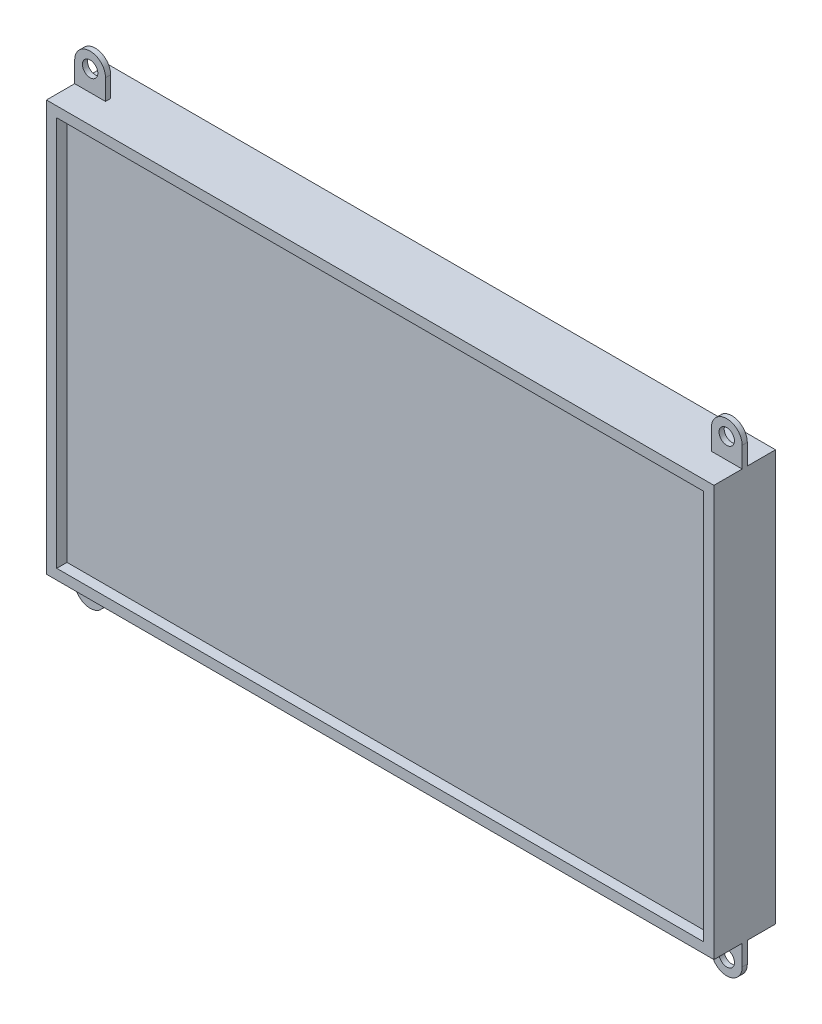
ISO-10303-21;
HEADER;
FILE_DESCRIPTION(('STEP AP214'),'2;1');
FILE_NAME('part.step','',(''),(''),'','','');
FILE_SCHEMA(('AUTOMOTIVE_DESIGN { 1 0 10303 214 1 1 1 1 }'));
ENDSEC;
DATA;
#1=APPLICATION_CONTEXT('core data for automotive mechanical design processes');
#2=APPLICATION_PROTOCOL_DEFINITION('international standard','automotive_design',2000,#1);
#3=PRODUCT_CONTEXT('',#1,'mechanical');
#4=PRODUCT('Part','Part','',(#3));
#5=PRODUCT_RELATED_PRODUCT_CATEGORY('part','',(#4));
#6=PRODUCT_DEFINITION_FORMATION('','',#4);
#7=PRODUCT_DEFINITION_CONTEXT('part definition',#1,'design');
#8=PRODUCT_DEFINITION('design','',#6,#7);
#9=PRODUCT_DEFINITION_SHAPE('','',#8);
#10=(LENGTH_UNIT() NAMED_UNIT(*) SI_UNIT(.MILLI.,.METRE.));
#11=(NAMED_UNIT(*) PLANE_ANGLE_UNIT() SI_UNIT($,.RADIAN.));
#12=(NAMED_UNIT(*) SI_UNIT($,.STERADIAN.) SOLID_ANGLE_UNIT());
#13=UNCERTAINTY_MEASURE_WITH_UNIT(LENGTH_MEASURE(1.E-05),#10,'distance_accuracy_value','');
#14=(GEOMETRIC_REPRESENTATION_CONTEXT(3) GLOBAL_UNCERTAINTY_ASSIGNED_CONTEXT((#13)) GLOBAL_UNIT_ASSIGNED_CONTEXT((#10,
#11,#12)) REPRESENTATION_CONTEXT('',''));
#15=CARTESIAN_POINT('',(0.,0.,0.));
#16=DIRECTION('',(0.,0.,1.));
#17=DIRECTION('',(1.,0.,0.));
#18=AXIS2_PLACEMENT_3D('',#15,#16,#17);
#19=CARTESIAN_POINT('',(-82.55,50.8,7.62));
#20=DIRECTION('',(0.,-1.,0.));
#21=DIRECTION('',(0.,0.,-1.));
#22=AXIS2_PLACEMENT_3D('',#19,#20,#21);
#23=PLANE('',#22);
#24=DIRECTION('',(0.,0.,-1.));
#25=VECTOR('',#24,1.);
#26=CARTESIAN_POINT('',(-74.93,50.8,0.635));
#27=LINE('',#26,#25);
#28=CARTESIAN_POINT('',(-74.93,50.8,0.635));
#29=VERTEX_POINT('',#28);
#30=CARTESIAN_POINT('',(-74.93,50.8,-0.635));
#31=VERTEX_POINT('',#30);
#32=EDGE_CURVE('E214',#29,#31,#27,.T.);
#33=ORIENTED_EDGE('',*,*,#32,.F.);
#34=DIRECTION('',(1.,0.,0.));
#35=VECTOR('',#34,1.);
#36=CARTESIAN_POINT('',(-82.55,50.8,0.635));
#37=LINE('',#36,#35);
#38=CARTESIAN_POINT('',(-82.55,50.8,0.635));
#39=VERTEX_POINT('',#38);
#40=EDGE_CURVE('E200',#39,#29,#37,.T.);
#41=ORIENTED_EDGE('',*,*,#40,.F.);
#42=DIRECTION('',(0.,0.,-1.));
#43=VECTOR('',#42,1.);
#44=CARTESIAN_POINT('',(-82.55,50.8,7.62));
#45=LINE('',#44,#43);
#46=CARTESIAN_POINT('',(-82.55,50.8,7.62));
#47=VERTEX_POINT('',#46);
#48=EDGE_CURVE('E211',#47,#39,#45,.T.);
#49=ORIENTED_EDGE('',*,*,#48,.F.);
#50=DIRECTION('',(-1.,0.,0.));
#51=VECTOR('',#50,1.);
#52=CARTESIAN_POINT('',(-82.55,50.8,7.62));
#53=LINE('',#52,#51);
#54=CARTESIAN_POINT('',(82.55,50.8,7.62));
#55=VERTEX_POINT('',#54);
#56=EDGE_CURVE('E302',#55,#47,#53,.T.);
#57=ORIENTED_EDGE('',*,*,#56,.F.);
#58=DIRECTION('',(0.,0.,-1.));
#59=VECTOR('',#58,1.);
#60=CARTESIAN_POINT('',(82.55,50.8,7.62));
#61=LINE('',#60,#59);
#62=CARTESIAN_POINT('',(82.55,50.8,0.635));
#63=VERTEX_POINT('',#62);
#64=EDGE_CURVE('E11',#55,#63,#61,.T.);
#65=ORIENTED_EDGE('',*,*,#64,.T.);
#66=DIRECTION('',(-1.,0.,0.));
#67=VECTOR('',#66,1.);
#68=CARTESIAN_POINT('',(82.55,50.8,0.635));
#69=LINE('',#68,#67);
#70=CARTESIAN_POINT('',(74.93,50.8,0.635));
#71=VERTEX_POINT('',#70);
#72=EDGE_CURVE('E231',#63,#71,#69,.T.);
#73=ORIENTED_EDGE('',*,*,#72,.T.);
#74=DIRECTION('',(0.,0.,-1.));
#75=VECTOR('',#74,1.);
#76=CARTESIAN_POINT('',(74.93,50.8,0.635));
#77=LINE('',#76,#75);
#78=CARTESIAN_POINT('',(74.93,50.8,-0.635));
#79=VERTEX_POINT('',#78);
#80=EDGE_CURVE('E241',#71,#79,#77,.T.);
#81=ORIENTED_EDGE('',*,*,#80,.T.);
#82=DIRECTION('',(-1.,0.,0.));
#83=VECTOR('',#82,1.);
#84=CARTESIAN_POINT('',(82.55,50.8,-0.635));
#85=LINE('',#84,#83);
#86=CARTESIAN_POINT('',(82.55,50.8,-0.635));
#87=VERTEX_POINT('',#86);
#88=EDGE_CURVE('E245',#87,#79,#85,.T.);
#89=ORIENTED_EDGE('',*,*,#88,.F.);
#90=CARTESIAN_POINT('',(82.55,50.8,-7.62));
#91=VERTEX_POINT('',#90);
#92=EDGE_CURVE('E42',#87,#91,#61,.T.);
#93=ORIENTED_EDGE('',*,*,#92,.T.);
#94=DIRECTION('',(-1.,0.,0.));
#95=VECTOR('',#94,1.);
#96=CARTESIAN_POINT('',(-82.55,50.8,-7.62));
#97=LINE('',#96,#95);
#98=CARTESIAN_POINT('',(-82.55,50.8,-7.62));
#99=VERTEX_POINT('',#98);
#100=EDGE_CURVE('E311',#91,#99,#97,.T.);
#101=ORIENTED_EDGE('',*,*,#100,.T.);
#102=CARTESIAN_POINT('',(-82.55,50.8,-0.634999999999998));
#103=VERTEX_POINT('',#102);
#104=EDGE_CURVE('E221',#103,#99,#45,.T.);
#105=ORIENTED_EDGE('',*,*,#104,.F.);
#106=DIRECTION('',(1.,0.,0.));
#107=VECTOR('',#106,1.);
#108=CARTESIAN_POINT('',(-82.55,50.8,-0.635));
#109=LINE('',#108,#107);
#110=EDGE_CURVE('E50',#103,#31,#109,.T.);
#111=ORIENTED_EDGE('',*,*,#110,.T.);
#112=EDGE_LOOP('',(#33,#41,#49,#57,#65,#73,#81,#89,#93,#101,#105,#111));
#113=FACE_BOUND('',#112,.T.);
#114=ADVANCED_FACE('F33',(#113),#23,.F.);
#115=CARTESIAN_POINT('',(82.55,50.8,7.62));
#116=DIRECTION('',(-1.,0.,0.));
#117=DIRECTION('',(0.,0.,1.));
#118=AXIS2_PLACEMENT_3D('',#115,#116,#117);
#119=PLANE('',#118);
#120=DIRECTION('',(0.,1.,0.));
#121=VECTOR('',#120,1.);
#122=CARTESIAN_POINT('',(82.55,50.8,-7.62));
#123=LINE('',#122,#121);
#124=CARTESIAN_POINT('',(82.55,-50.8,-7.62));
#125=VERTEX_POINT('',#124);
#126=EDGE_CURVE('E292',#125,#91,#123,.T.);
#127=ORIENTED_EDGE('',*,*,#126,.T.);
#128=ORIENTED_EDGE('',*,*,#92,.F.);
#129=DIRECTION('',(0.,-1.,0.));
#130=VECTOR('',#129,1.);
#131=CARTESIAN_POINT('',(82.55,55.88,-0.635));
#132=LINE('',#131,#130);
#133=CARTESIAN_POINT('',(82.55,55.88,-0.635));
#134=VERTEX_POINT('',#133);
#135=EDGE_CURVE('E235',#134,#87,#132,.T.);
#136=ORIENTED_EDGE('',*,*,#135,.F.);
#137=DIRECTION('',(0.,0.,-1.));
#138=VECTOR('',#137,1.);
#139=CARTESIAN_POINT('',(82.55,55.88,0.635));
#140=LINE('',#139,#138);
#141=CARTESIAN_POINT('',(82.55,55.88,0.635));
#142=VERTEX_POINT('',#141);
#143=EDGE_CURVE('E260',#142,#134,#140,.T.);
#144=ORIENTED_EDGE('',*,*,#143,.F.);
#145=DIRECTION('',(0.,-1.,0.));
#146=VECTOR('',#145,1.);
#147=CARTESIAN_POINT('',(82.55,55.88,0.635));
#148=LINE('',#147,#146);
#149=EDGE_CURVE('E238',#142,#63,#148,.T.);
#150=ORIENTED_EDGE('',*,*,#149,.T.);
#151=ORIENTED_EDGE('',*,*,#64,.F.);
#152=DIRECTION('',(0.,1.,0.));
#153=VECTOR('',#152,1.);
#154=CARTESIAN_POINT('',(82.55,50.8,7.62));
#155=LINE('',#154,#153);
#156=CARTESIAN_POINT('',(82.55,-50.8,7.62));
#157=VERTEX_POINT('',#156);
#158=EDGE_CURVE('E299',#157,#55,#155,.T.);
#159=ORIENTED_EDGE('',*,*,#158,.F.);
#160=DIRECTION('',(0.,0.,-1.));
#161=VECTOR('',#160,1.);
#162=CARTESIAN_POINT('',(82.55,-50.8,7.62));
#163=LINE('',#162,#161);
#164=CARTESIAN_POINT('',(82.55,-50.8,0.635000000000004));
#165=VERTEX_POINT('',#164);
#166=EDGE_CURVE('E322',#157,#165,#163,.T.);
#167=ORIENTED_EDGE('',*,*,#166,.T.);
#168=DIRECTION('',(0.,1.,0.));
#169=VECTOR('',#168,1.);
#170=CARTESIAN_POINT('',(82.55,-55.88,0.635));
#171=LINE('',#170,#169);
#172=CARTESIAN_POINT('',(82.55,-55.88,0.635));
#173=VERTEX_POINT('',#172);
#174=EDGE_CURVE('E364',#173,#165,#171,.T.);
#175=ORIENTED_EDGE('',*,*,#174,.F.);
#176=DIRECTION('',(0.,0.,-1.));
#177=VECTOR('',#176,1.);
#178=CARTESIAN_POINT('',(82.55,-55.88,0.635));
#179=LINE('',#178,#177);
#180=CARTESIAN_POINT('',(82.55,-55.88,-0.635));
#181=VERTEX_POINT('',#180);
#182=EDGE_CURVE('E340',#173,#181,#179,.T.);
#183=ORIENTED_EDGE('',*,*,#182,.T.);
#184=DIRECTION('',(0.,1.,0.));
#185=VECTOR('',#184,1.);
#186=CARTESIAN_POINT('',(82.55,-55.88,-0.635));
#187=LINE('',#186,#185);
#188=CARTESIAN_POINT('',(82.55,-50.8,-0.634999999999992));
#189=VERTEX_POINT('',#188);
#190=EDGE_CURVE('E381',#181,#189,#187,.T.);
#191=ORIENTED_EDGE('',*,*,#190,.T.);
#192=EDGE_CURVE('E308',#189,#125,#163,.T.);
#193=ORIENTED_EDGE('',*,*,#192,.T.);
#194=EDGE_LOOP('',(#127,#128,#136,#144,#150,#151,#159,#167,#175,#183,#191,#193));
#195=FACE_BOUND('',#194,.T.);
#196=ADVANCED_FACE('F35',(#195),#119,.F.);
#197=CARTESIAN_POINT('',(-82.55,50.8,7.62));
#198=DIRECTION('',(1.,0.,0.));
#199=DIRECTION('',(0.,1.,0.));
#200=AXIS2_PLACEMENT_3D('',#197,#198,#199);
#201=PLANE('',#200);
#202=DIRECTION('',(0.,-1.,0.));
#203=VECTOR('',#202,1.);
#204=CARTESIAN_POINT('',(-82.55,50.8,-7.62));
#205=LINE('',#204,#203);
#206=CARTESIAN_POINT('',(-82.55,-50.8,-7.62));
#207=VERTEX_POINT('',#206);
#208=EDGE_CURVE('E314',#99,#207,#205,.T.);
#209=ORIENTED_EDGE('',*,*,#208,.T.);
#210=DIRECTION('',(0.,0.,-1.));
#211=VECTOR('',#210,1.);
#212=CARTESIAN_POINT('',(-82.55,-50.8,7.62));
#213=LINE('',#212,#211);
#214=CARTESIAN_POINT('',(-82.55,-50.8,-0.634999999999996));
#215=VERTEX_POINT('',#214);
#216=EDGE_CURVE('E325',#215,#207,#213,.T.);
#217=ORIENTED_EDGE('',*,*,#216,.F.);
#218=DIRECTION('',(0.,1.,0.));
#219=VECTOR('',#218,1.);
#220=CARTESIAN_POINT('',(-82.55,-55.88,-0.635));
#221=LINE('',#220,#219);
#222=CARTESIAN_POINT('',(-82.55,-55.88,-0.635));
#223=VERTEX_POINT('',#222);
#224=EDGE_CURVE('E710',#223,#215,#221,.T.);
#225=ORIENTED_EDGE('',*,*,#224,.F.);
#226=DIRECTION('',(0.,0.,-1.));
#227=VECTOR('',#226,1.);
#228=CARTESIAN_POINT('',(-82.55,-55.88,0.635));
#229=LINE('',#228,#227);
#230=CARTESIAN_POINT('',(-82.55,-55.88,0.635));
#231=VERTEX_POINT('',#230);
#232=EDGE_CURVE('E731',#231,#223,#229,.T.);
#233=ORIENTED_EDGE('',*,*,#232,.F.);
#234=DIRECTION('',(0.,1.,0.));
#235=VECTOR('',#234,1.);
#236=CARTESIAN_POINT('',(-82.55,-55.88,0.635));
#237=LINE('',#236,#235);
#238=CARTESIAN_POINT('',(-82.55,-50.8,0.635000000000002));
#239=VERTEX_POINT('',#238);
#240=EDGE_CURVE('E716',#231,#239,#237,.T.);
#241=ORIENTED_EDGE('',*,*,#240,.T.);
#242=CARTESIAN_POINT('',(-82.55,-50.8,7.62));
#243=VERTEX_POINT('',#242);
#244=EDGE_CURVE('E224',#243,#239,#213,.T.);
#245=ORIENTED_EDGE('',*,*,#244,.F.);
#246=DIRECTION('',(0.,-1.,0.));
#247=VECTOR('',#246,1.);
#248=CARTESIAN_POINT('',(-82.55,50.8,7.62));
#249=LINE('',#248,#247);
#250=EDGE_CURVE('E220',#47,#243,#249,.T.);
#251=ORIENTED_EDGE('',*,*,#250,.F.);
#252=ORIENTED_EDGE('',*,*,#48,.T.);
#253=DIRECTION('',(0.,-1.,0.));
#254=VECTOR('',#253,1.);
#255=CARTESIAN_POINT('',(-82.55,55.88,0.635));
#256=LINE('',#255,#254);
#257=CARTESIAN_POINT('',(-82.55,55.88,0.635));
#258=VERTEX_POINT('',#257);
#259=EDGE_CURVE('E197',#258,#39,#256,.T.);
#260=ORIENTED_EDGE('',*,*,#259,.F.);
#261=DIRECTION('',(0.,0.,-1.));
#262=VECTOR('',#261,1.);
#263=CARTESIAN_POINT('',(-82.55,55.88,0.635));
#264=LINE('',#263,#262);
#265=CARTESIAN_POINT('',(-82.55,55.88,-0.635));
#266=VERTEX_POINT('',#265);
#267=EDGE_CURVE('E693',#258,#266,#264,.T.);
#268=ORIENTED_EDGE('',*,*,#267,.T.);
#269=DIRECTION('',(0.,-1.,0.));
#270=VECTOR('',#269,1.);
#271=CARTESIAN_POINT('',(-82.55,55.88,-0.635));
#272=LINE('',#271,#270);
#273=EDGE_CURVE('E687',#266,#103,#272,.T.);
#274=ORIENTED_EDGE('',*,*,#273,.T.);
#275=ORIENTED_EDGE('',*,*,#104,.T.);
#276=EDGE_LOOP('',(#209,#217,#225,#233,#241,#245,#251,#252,#260,#268,#274,#275));
#277=FACE_BOUND('',#276,.T.);
#278=ADVANCED_FACE('F218',(#277),#201,.F.);
#279=CARTESIAN_POINT('',(-82.55,-50.8,7.62));
#280=DIRECTION('',(0.,1.,0.));
#281=DIRECTION('',(0.,0.,1.));
#282=AXIS2_PLACEMENT_3D('',#279,#280,#281);
#283=PLANE('',#282);
#284=ORIENTED_EDGE('',*,*,#244,.T.);
#285=DIRECTION('',(1.,0.,0.));
#286=VECTOR('',#285,1.);
#287=CARTESIAN_POINT('',(-82.55,-50.8,0.635));
#288=LINE('',#287,#286);
#289=CARTESIAN_POINT('',(-74.93,-50.8,0.635));
#290=VERTEX_POINT('',#289);
#291=EDGE_CURVE('E58',#239,#290,#288,.T.);
#292=ORIENTED_EDGE('',*,*,#291,.T.);
#293=DIRECTION('',(0.,0.,-1.));
#294=VECTOR('',#293,1.);
#295=CARTESIAN_POINT('',(-74.93,-50.8,0.635));
#296=LINE('',#295,#294);
#297=CARTESIAN_POINT('',(-74.93,-50.8,-0.635));
#298=VERTEX_POINT('',#297);
#299=EDGE_CURVE('E719',#290,#298,#296,.T.);
#300=ORIENTED_EDGE('',*,*,#299,.T.);
#301=DIRECTION('',(1.,0.,0.));
#302=VECTOR('',#301,1.);
#303=CARTESIAN_POINT('',(-82.55,-50.8,-0.635));
#304=LINE('',#303,#302);
#305=EDGE_CURVE('E720',#215,#298,#304,.T.);
#306=ORIENTED_EDGE('',*,*,#305,.F.);
#307=ORIENTED_EDGE('',*,*,#216,.T.);
#308=DIRECTION('',(1.,0.,0.));
#309=VECTOR('',#308,1.);
#310=CARTESIAN_POINT('',(-82.55,-50.8,-7.62));
#311=LINE('',#310,#309);
#312=EDGE_CURVE('E303',#207,#125,#311,.T.);
#313=ORIENTED_EDGE('',*,*,#312,.T.);
#314=ORIENTED_EDGE('',*,*,#192,.F.);
#315=DIRECTION('',(-1.,0.,0.));
#316=VECTOR('',#315,1.);
#317=CARTESIAN_POINT('',(82.55,-50.8,-0.635));
#318=LINE('',#317,#316);
#319=CARTESIAN_POINT('',(74.93,-50.8,-0.635));
#320=VERTEX_POINT('',#319);
#321=EDGE_CURVE('E385',#189,#320,#318,.T.);
#322=ORIENTED_EDGE('',*,*,#321,.T.);
#323=DIRECTION('',(0.,0.,-1.));
#324=VECTOR('',#323,1.);
#325=CARTESIAN_POINT('',(74.93,-50.8,0.635));
#326=LINE('',#325,#324);
#327=CARTESIAN_POINT('',(74.93,-50.8,0.635));
#328=VERTEX_POINT('',#327);
#329=EDGE_CURVE('E332',#328,#320,#326,.T.);
#330=ORIENTED_EDGE('',*,*,#329,.F.);
#331=DIRECTION('',(-1.,0.,0.));
#332=VECTOR('',#331,1.);
#333=CARTESIAN_POINT('',(82.55,-50.8,0.635));
#334=LINE('',#333,#332);
#335=EDGE_CURVE('E368',#165,#328,#334,.T.);
#336=ORIENTED_EDGE('',*,*,#335,.F.);
#337=ORIENTED_EDGE('',*,*,#166,.F.);
#338=DIRECTION('',(1.,0.,0.));
#339=VECTOR('',#338,1.);
#340=CARTESIAN_POINT('',(-82.55,-50.8,7.62));
#341=LINE('',#340,#339);
#342=EDGE_CURVE('E306',#243,#157,#341,.T.);
#343=ORIENTED_EDGE('',*,*,#342,.F.);
#344=EDGE_LOOP('',(#284,#292,#300,#306,#307,#313,#314,#322,#330,#336,#337,#343));
#345=FACE_BOUND('',#344,.T.);
#346=ADVANCED_FACE('F411',(#345),#283,.F.);
#347=CARTESIAN_POINT('',(0.,0.,7.62));
#348=DIRECTION('',(0.,0.,1.));
#349=DIRECTION('',(1.,0.,0.));
#350=AXIS2_PLACEMENT_3D('',#347,#348,#349);
#351=PLANE('',#350);
#352=DIRECTION('',(0.,1.,0.));
#353=VECTOR('',#352,1.);
#354=CARTESIAN_POINT('',(80.01,48.26,7.62));
#355=LINE('',#354,#353);
#356=CARTESIAN_POINT('',(80.01,-48.26,7.62));
#357=VERTEX_POINT('',#356);
#358=CARTESIAN_POINT('',(80.01,48.26,7.62));
#359=VERTEX_POINT('',#358);
#360=EDGE_CURVE('E262',#357,#359,#355,.T.);
#361=ORIENTED_EDGE('',*,*,#360,.F.);
#362=DIRECTION('',(1.,0.,0.));
#363=VECTOR('',#362,1.);
#364=CARTESIAN_POINT('',(-80.01,-48.26,7.62));
#365=LINE('',#364,#363);
#366=CARTESIAN_POINT('',(-80.01,-48.26,7.62));
#367=VERTEX_POINT('',#366);
#368=EDGE_CURVE('E271',#367,#357,#365,.T.);
#369=ORIENTED_EDGE('',*,*,#368,.F.);
#370=DIRECTION('',(0.,-1.,0.));
#371=VECTOR('',#370,1.);
#372=CARTESIAN_POINT('',(-80.01,48.26,7.62));
#373=LINE('',#372,#371);
#374=CARTESIAN_POINT('',(-80.01,48.26,7.62));
#375=VERTEX_POINT('',#374);
#376=EDGE_CURVE('E285',#375,#367,#373,.T.);
#377=ORIENTED_EDGE('',*,*,#376,.F.);
#378=DIRECTION('',(-1.,0.,0.));
#379=VECTOR('',#378,1.);
#380=CARTESIAN_POINT('',(-80.01,48.26,7.62));
#381=LINE('',#380,#379);
#382=EDGE_CURVE('E282',#359,#375,#381,.T.);
#383=ORIENTED_EDGE('',*,*,#382,.F.);
#384=EDGE_LOOP('',(#361,#369,#377,#383));
#385=FACE_BOUND('',#384,.T.);
#386=ORIENTED_EDGE('',*,*,#158,.T.);
#387=ORIENTED_EDGE('',*,*,#56,.T.);
#388=ORIENTED_EDGE('',*,*,#250,.T.);
#389=ORIENTED_EDGE('',*,*,#342,.T.);
#390=EDGE_LOOP('',(#386,#387,#388,#389));
#391=FACE_BOUND('',#390,.T.);
#392=ADVANCED_FACE('F358',(#385,#391),#351,.T.);
#393=CARTESIAN_POINT('',(0.,0.,-7.62));
#394=DIRECTION('',(0.,0.,1.));
#395=DIRECTION('',(1.,0.,0.));
#396=AXIS2_PLACEMENT_3D('',#393,#394,#395);
#397=PLANE('',#396);
#398=ORIENTED_EDGE('',*,*,#126,.F.);
#399=ORIENTED_EDGE('',*,*,#312,.F.);
#400=ORIENTED_EDGE('',*,*,#208,.F.);
#401=ORIENTED_EDGE('',*,*,#100,.F.);
#402=EDGE_LOOP('',(#398,#399,#400,#401));
#403=FACE_BOUND('',#402,.T.);
#404=ADVANCED_FACE('F416',(#403),#397,.F.);
#405=CARTESIAN_POINT('',(80.01,48.26,5.08));
#406=DIRECTION('',(1.,0.,0.));
#407=DIRECTION('',(0.,0.,-1.));
#408=AXIS2_PLACEMENT_3D('',#405,#406,#407);
#409=PLANE('',#408);
#410=ORIENTED_EDGE('',*,*,#360,.T.);
#411=DIRECTION('',(0.,0.,1.));
#412=VECTOR('',#411,1.);
#413=CARTESIAN_POINT('',(80.01,48.26,5.08));
#414=LINE('',#413,#412);
#415=CARTESIAN_POINT('',(80.01,48.26,5.08));
#416=VERTEX_POINT('',#415);
#417=EDGE_CURVE('E280',#416,#359,#414,.T.);
#418=ORIENTED_EDGE('',*,*,#417,.F.);
#419=DIRECTION('',(0.,1.,0.));
#420=VECTOR('',#419,1.);
#421=CARTESIAN_POINT('',(80.01,48.26,5.08));
#422=LINE('',#421,#420);
#423=CARTESIAN_POINT('',(80.01,-48.26,5.08));
#424=VERTEX_POINT('',#423);
#425=EDGE_CURVE('E267',#424,#416,#422,.T.);
#426=ORIENTED_EDGE('',*,*,#425,.F.);
#427=DIRECTION('',(0.,0.,1.));
#428=VECTOR('',#427,1.);
#429=CARTESIAN_POINT('',(80.01,-48.26,5.08));
#430=LINE('',#429,#428);
#431=EDGE_CURVE('E290',#424,#357,#430,.T.);
#432=ORIENTED_EDGE('',*,*,#431,.T.);
#433=EDGE_LOOP('',(#410,#418,#426,#432));
#434=FACE_BOUND('',#433,.T.);
#435=ADVANCED_FACE('F445',(#434),#409,.F.);
#436=CARTESIAN_POINT('',(-80.01,-48.26,5.08));
#437=DIRECTION('',(0.,-1.,0.));
#438=DIRECTION('',(0.,0.,-1.));
#439=AXIS2_PLACEMENT_3D('',#436,#437,#438);
#440=PLANE('',#439);
#441=ORIENTED_EDGE('',*,*,#368,.T.);
#442=ORIENTED_EDGE('',*,*,#431,.F.);
#443=DIRECTION('',(1.,0.,0.));
#444=VECTOR('',#443,1.);
#445=CARTESIAN_POINT('',(-80.01,-48.26,5.08));
#446=LINE('',#445,#444);
#447=CARTESIAN_POINT('',(-80.01,-48.26,5.08));
#448=VERTEX_POINT('',#447);
#449=EDGE_CURVE('E277',#448,#424,#446,.T.);
#450=ORIENTED_EDGE('',*,*,#449,.F.);
#451=DIRECTION('',(0.,0.,1.));
#452=VECTOR('',#451,1.);
#453=CARTESIAN_POINT('',(-80.01,-48.26,5.08));
#454=LINE('',#453,#452);
#455=EDGE_CURVE('E293',#448,#367,#454,.T.);
#456=ORIENTED_EDGE('',*,*,#455,.T.);
#457=EDGE_LOOP('',(#441,#442,#450,#456));
#458=FACE_BOUND('',#457,.T.);
#459=ADVANCED_FACE('F451',(#458),#440,.F.);
#460=CARTESIAN_POINT('',(-80.01,48.26,5.08));
#461=DIRECTION('',(-1.,0.,0.));
#462=DIRECTION('',(0.,0.,1.));
#463=AXIS2_PLACEMENT_3D('',#460,#461,#462);
#464=PLANE('',#463);
#465=ORIENTED_EDGE('',*,*,#376,.T.);
#466=ORIENTED_EDGE('',*,*,#455,.F.);
#467=DIRECTION('',(0.,-1.,0.));
#468=VECTOR('',#467,1.);
#469=CARTESIAN_POINT('',(-80.01,48.26,5.08));
#470=LINE('',#469,#468);
#471=CARTESIAN_POINT('',(-80.01,48.26,5.08));
#472=VERTEX_POINT('',#471);
#473=EDGE_CURVE('E274',#472,#448,#470,.T.);
#474=ORIENTED_EDGE('',*,*,#473,.F.);
#475=DIRECTION('',(0.,0.,1.));
#476=VECTOR('',#475,1.);
#477=CARTESIAN_POINT('',(-80.01,48.26,5.08));
#478=LINE('',#477,#476);
#479=EDGE_CURVE('E295',#472,#375,#478,.T.);
#480=ORIENTED_EDGE('',*,*,#479,.T.);
#481=EDGE_LOOP('',(#465,#466,#474,#480));
#482=FACE_BOUND('',#481,.T.);
#483=ADVANCED_FACE('F456',(#482),#464,.F.);
#484=CARTESIAN_POINT('',(-80.01,48.26,5.08));
#485=DIRECTION('',(0.,1.,0.));
#486=DIRECTION('',(0.,0.,1.));
#487=AXIS2_PLACEMENT_3D('',#484,#485,#486);
#488=PLANE('',#487);
#489=ORIENTED_EDGE('',*,*,#382,.T.);
#490=ORIENTED_EDGE('',*,*,#479,.F.);
#491=DIRECTION('',(-1.,0.,0.));
#492=VECTOR('',#491,1.);
#493=CARTESIAN_POINT('',(-80.01,48.26,5.08));
#494=LINE('',#493,#492);
#495=EDGE_CURVE('E270',#416,#472,#494,.T.);
#496=ORIENTED_EDGE('',*,*,#495,.F.);
#497=ORIENTED_EDGE('',*,*,#417,.T.);
#498=EDGE_LOOP('',(#489,#490,#496,#497));
#499=FACE_BOUND('',#498,.T.);
#500=ADVANCED_FACE('F453',(#499),#488,.F.);
#501=CARTESIAN_POINT('',(0.,0.,5.08));
#502=DIRECTION('',(0.,0.,1.));
#503=DIRECTION('',(1.,0.,0.));
#504=AXIS2_PLACEMENT_3D('',#501,#502,#503);
#505=PLANE('',#504);
#506=ORIENTED_EDGE('',*,*,#425,.T.);
#507=ORIENTED_EDGE('',*,*,#495,.T.);
#508=ORIENTED_EDGE('',*,*,#473,.T.);
#509=ORIENTED_EDGE('',*,*,#449,.T.);
#510=EDGE_LOOP('',(#506,#507,#508,#509));
#511=FACE_BOUND('',#510,.T.);
#512=ADVANCED_FACE('F431',(#511),#505,.T.);
#513=CARTESIAN_POINT('',(78.74,55.88,0.635));
#514=DIRECTION('',(0.,0.,-1.));
#515=DIRECTION('',(-1.,0.,0.));
#516=AXIS2_PLACEMENT_3D('',#513,#514,#515);
#517=CYLINDRICAL_SURFACE('',#516,3.81);
#518=CARTESIAN_POINT('',(78.74,55.88,-0.635));
#519=DIRECTION('',(0.,0.,-1.));
#520=DIRECTION('',(1.,0.,0.));
#521=AXIS2_PLACEMENT_3D('',#518,#519,#520);
#522=CIRCLE('',#521,3.81);
#523=CARTESIAN_POINT('',(74.93,55.88,-0.635));
#524=VERTEX_POINT('',#523);
#525=EDGE_CURVE('E257',#524,#134,#522,.T.);
#526=ORIENTED_EDGE('',*,*,#525,.F.);
#527=DIRECTION('',(0.,0.,-1.));
#528=VECTOR('',#527,1.);
#529=CARTESIAN_POINT('',(74.93,55.88,0.635));
#530=LINE('',#529,#528);
#531=CARTESIAN_POINT('',(74.93,55.88,0.635));
#532=VERTEX_POINT('',#531);
#533=EDGE_CURVE('E263',#532,#524,#530,.T.);
#534=ORIENTED_EDGE('',*,*,#533,.F.);
#535=CARTESIAN_POINT('',(78.74,55.88,0.635));
#536=DIRECTION('',(0.,0.,-1.));
#537=DIRECTION('',(1.,0.,0.));
#538=AXIS2_PLACEMENT_3D('',#535,#536,#537);
#539=CIRCLE('',#538,3.81);
#540=EDGE_CURVE('E242',#532,#142,#539,.T.);
#541=ORIENTED_EDGE('',*,*,#540,.T.);
#542=ORIENTED_EDGE('',*,*,#143,.T.);
#543=EDGE_LOOP('',(#526,#534,#541,#542));
#544=FACE_BOUND('',#543,.T.);
#545=ADVANCED_FACE('F350',(#544),#517,.T.);
#546=CARTESIAN_POINT('',(74.93,55.88,0.635));
#547=DIRECTION('',(-1.,0.,0.));
#548=DIRECTION('',(0.,-1.,0.));
#549=AXIS2_PLACEMENT_3D('',#546,#547,#548);
#550=PLANE('',#549);
#551=DIRECTION('',(0.,1.,0.));
#552=VECTOR('',#551,1.);
#553=CARTESIAN_POINT('',(74.93,55.88,-0.635));
#554=LINE('',#553,#552);
#555=EDGE_CURVE('E248',#79,#524,#554,.T.);
#556=ORIENTED_EDGE('',*,*,#555,.F.);
#557=ORIENTED_EDGE('',*,*,#80,.F.);
#558=DIRECTION('',(0.,1.,0.));
#559=VECTOR('',#558,1.);
#560=CARTESIAN_POINT('',(74.93,55.88,0.635));
#561=LINE('',#560,#559);
#562=EDGE_CURVE('E234',#71,#532,#561,.T.);
#563=ORIENTED_EDGE('',*,*,#562,.T.);
#564=ORIENTED_EDGE('',*,*,#533,.T.);
#565=EDGE_LOOP('',(#556,#557,#563,#564));
#566=FACE_BOUND('',#565,.T.);
#567=ADVANCED_FACE('F422',(#566),#550,.T.);
#568=CARTESIAN_POINT('',(78.74,55.88,0.635));
#569=DIRECTION('',(0.,0.,1.));
#570=DIRECTION('',(1.,0.,0.));
#571=AXIS2_PLACEMENT_3D('',#568,#569,#570);
#572=PLANE('',#571);
#573=CARTESIAN_POINT('',(78.74,55.88,0.635));
#574=DIRECTION('',(0.,0.,1.));
#575=DIRECTION('',(1.,0.,0.));
#576=AXIS2_PLACEMENT_3D('',#573,#574,#575);
#577=CIRCLE('',#576,1.90500000000001);
#578=CARTESIAN_POINT('',(80.645,55.88,0.635));
#579=VERTEX_POINT('',#578);
#580=EDGE_CURVE('E327',#579,#579,#577,.T.);
#581=ORIENTED_EDGE('',*,*,#580,.F.);
#582=EDGE_LOOP('',(#581));
#583=FACE_BOUND('',#582,.T.);
#584=ORIENTED_EDGE('',*,*,#72,.F.);
#585=ORIENTED_EDGE('',*,*,#149,.F.);
#586=ORIENTED_EDGE('',*,*,#540,.F.);
#587=ORIENTED_EDGE('',*,*,#562,.F.);
#588=EDGE_LOOP('',(#584,#585,#586,#587));
#589=FACE_BOUND('',#588,.T.);
#590=ADVANCED_FACE('F352',(#583,#589),#572,.T.);
#591=CARTESIAN_POINT('',(78.74,55.88,-0.635));
#592=DIRECTION('',(0.,0.,1.));
#593=DIRECTION('',(1.,0.,0.));
#594=AXIS2_PLACEMENT_3D('',#591,#592,#593);
#595=PLANE('',#594);
#596=CARTESIAN_POINT('',(78.74,55.88,-0.635));
#597=DIRECTION('',(0.,0.,1.));
#598=DIRECTION('',(1.,0.,0.));
#599=AXIS2_PLACEMENT_3D('',#596,#597,#598);
#600=CIRCLE('',#599,1.90500000000001);
#601=CARTESIAN_POINT('',(80.645,55.88,-0.635));
#602=VERTEX_POINT('',#601);
#603=EDGE_CURVE('E249',#602,#602,#600,.T.);
#604=ORIENTED_EDGE('',*,*,#603,.T.);
#605=EDGE_LOOP('',(#604));
#606=FACE_BOUND('',#605,.T.);
#607=ORIENTED_EDGE('',*,*,#88,.T.);
#608=ORIENTED_EDGE('',*,*,#555,.T.);
#609=ORIENTED_EDGE('',*,*,#525,.T.);
#610=ORIENTED_EDGE('',*,*,#135,.T.);
#611=EDGE_LOOP('',(#607,#608,#609,#610));
#612=FACE_BOUND('',#611,.T.);
#613=ADVANCED_FACE('F420',(#606,#612),#595,.F.);
#614=CARTESIAN_POINT('',(78.74,55.88,-7.620025));
#615=DIRECTION('',(0.,0.,1.));
#616=DIRECTION('',(1.,0.,0.));
#617=AXIS2_PLACEMENT_3D('',#614,#615,#616);
#618=CYLINDRICAL_SURFACE('',#617,1.90500000000001);
#619=ORIENTED_EDGE('',*,*,#580,.T.);
#620=EDGE_LOOP('',(#619));
#621=FACE_BOUND('',#620,.T.);
#622=ORIENTED_EDGE('',*,*,#603,.F.);
#623=EDGE_LOOP('',(#622));
#624=FACE_BOUND('',#623,.T.);
#625=ADVANCED_FACE('F501',(#621,#624),#618,.F.);
#626=CARTESIAN_POINT('',(74.93,-55.88,0.635));
#627=DIRECTION('',(1.,0.,0.));
#628=DIRECTION('',(0.,1.,0.));
#629=AXIS2_PLACEMENT_3D('',#626,#627,#628);
#630=PLANE('',#629);
#631=DIRECTION('',(0.,-1.,0.));
#632=VECTOR('',#631,1.);
#633=CARTESIAN_POINT('',(74.93,-55.88,-0.635));
#634=LINE('',#633,#632);
#635=CARTESIAN_POINT('',(74.93,-55.88,-0.635));
#636=VERTEX_POINT('',#635);
#637=EDGE_CURVE('E375',#320,#636,#634,.T.);
#638=ORIENTED_EDGE('',*,*,#637,.T.);
#639=DIRECTION('',(0.,0.,-1.));
#640=VECTOR('',#639,1.);
#641=CARTESIAN_POINT('',(74.93,-55.88,0.635));
#642=LINE('',#641,#640);
#643=CARTESIAN_POINT('',(74.93,-55.88,0.635));
#644=VERTEX_POINT('',#643);
#645=EDGE_CURVE('E337',#644,#636,#642,.T.);
#646=ORIENTED_EDGE('',*,*,#645,.F.);
#647=DIRECTION('',(0.,-1.,0.));
#648=VECTOR('',#647,1.);
#649=CARTESIAN_POINT('',(74.93,-55.88,0.635));
#650=LINE('',#649,#648);
#651=EDGE_CURVE('E373',#328,#644,#650,.T.);
#652=ORIENTED_EDGE('',*,*,#651,.F.);
#653=ORIENTED_EDGE('',*,*,#329,.T.);
#654=EDGE_LOOP('',(#638,#646,#652,#653));
#655=FACE_BOUND('',#654,.T.);
#656=ADVANCED_FACE('F402',(#655),#630,.F.);
#657=CARTESIAN_POINT('',(78.74,-55.88,0.635));
#658=DIRECTION('',(0.,0.,-1.));
#659=DIRECTION('',(-1.,0.,0.));
#660=AXIS2_PLACEMENT_3D('',#657,#658,#659);
#661=CYLINDRICAL_SURFACE('',#660,3.81);
#662=CARTESIAN_POINT('',(78.74,-55.88,-0.635));
#663=DIRECTION('',(0.,0.,1.));
#664=DIRECTION('',(1.,0.,0.));
#665=AXIS2_PLACEMENT_3D('',#662,#663,#664);
#666=CIRCLE('',#665,3.81);
#667=EDGE_CURVE('E384',#636,#181,#666,.T.);
#668=ORIENTED_EDGE('',*,*,#667,.T.);
#669=ORIENTED_EDGE('',*,*,#182,.F.);
#670=CARTESIAN_POINT('',(78.74,-55.88,0.635));
#671=DIRECTION('',(0.,0.,1.));
#672=DIRECTION('',(1.,0.,0.));
#673=AXIS2_PLACEMENT_3D('',#670,#671,#672);
#674=CIRCLE('',#673,3.81);
#675=EDGE_CURVE('E370',#644,#173,#674,.T.);
#676=ORIENTED_EDGE('',*,*,#675,.F.);
#677=ORIENTED_EDGE('',*,*,#645,.T.);
#678=EDGE_LOOP('',(#668,#669,#676,#677));
#679=FACE_BOUND('',#678,.T.);
#680=ADVANCED_FACE('F404',(#679),#661,.T.);
#681=CARTESIAN_POINT('',(78.74,-55.88,0.635));
#682=DIRECTION('',(0.,0.,1.));
#683=DIRECTION('',(1.,0.,0.));
#684=AXIS2_PLACEMENT_3D('',#681,#682,#683);
#685=PLANE('',#684);
#686=CARTESIAN_POINT('',(78.74,-55.88,0.635));
#687=DIRECTION('',(0.,0.,-1.));
#688=DIRECTION('',(1.,0.,0.));
#689=AXIS2_PLACEMENT_3D('',#686,#687,#688);
#690=CIRCLE('',#689,1.90500000000001);
#691=CARTESIAN_POINT('',(80.645,-55.88,0.635));
#692=VERTEX_POINT('',#691);
#693=EDGE_CURVE('E733',#692,#692,#690,.T.);
#694=ORIENTED_EDGE('',*,*,#693,.T.);
#695=EDGE_LOOP('',(#694));
#696=FACE_BOUND('',#695,.T.);
#697=ORIENTED_EDGE('',*,*,#335,.T.);
#698=ORIENTED_EDGE('',*,*,#651,.T.);
#699=ORIENTED_EDGE('',*,*,#675,.T.);
#700=ORIENTED_EDGE('',*,*,#174,.T.);
#701=EDGE_LOOP('',(#697,#698,#699,#700));
#702=FACE_BOUND('',#701,.T.);
#703=ADVANCED_FACE('F367',(#696,#702),#685,.T.);
#704=CARTESIAN_POINT('',(78.74,-55.88,-0.635));
#705=DIRECTION('',(0.,0.,1.));
#706=DIRECTION('',(1.,0.,0.));
#707=AXIS2_PLACEMENT_3D('',#704,#705,#706);
#708=PLANE('',#707);
#709=CARTESIAN_POINT('',(78.74,-55.88,-0.635));
#710=DIRECTION('',(0.,0.,1.));
#711=DIRECTION('',(1.,0.,0.));
#712=AXIS2_PLACEMENT_3D('',#709,#710,#711);
#713=CIRCLE('',#712,1.90500000000001);
#714=CARTESIAN_POINT('',(80.645,-55.88,-0.635));
#715=VERTEX_POINT('',#714);
#716=EDGE_CURVE('E390',#715,#715,#713,.F.);
#717=ORIENTED_EDGE('',*,*,#716,.F.);
#718=EDGE_LOOP('',(#717));
#719=FACE_BOUND('',#718,.T.);
#720=ORIENTED_EDGE('',*,*,#321,.F.);
#721=ORIENTED_EDGE('',*,*,#190,.F.);
#722=ORIENTED_EDGE('',*,*,#667,.F.);
#723=ORIENTED_EDGE('',*,*,#637,.F.);
#724=EDGE_LOOP('',(#720,#721,#722,#723));
#725=FACE_BOUND('',#724,.T.);
#726=ADVANCED_FACE('F407',(#719,#725),#708,.F.);
#727=CARTESIAN_POINT('',(78.74,-55.88,-7.620025));
#728=DIRECTION('',(0.,0.,1.));
#729=DIRECTION('',(1.,0.,0.));
#730=AXIS2_PLACEMENT_3D('',#727,#728,#729);
#731=CYLINDRICAL_SURFACE('',#730,1.90500000000001);
#732=ORIENTED_EDGE('',*,*,#693,.F.);
#733=EDGE_LOOP('',(#732));
#734=FACE_BOUND('',#733,.T.);
#735=ORIENTED_EDGE('',*,*,#716,.T.);
#736=EDGE_LOOP('',(#735));
#737=FACE_BOUND('',#736,.T.);
#738=ADVANCED_FACE('F549',(#734,#737),#731,.F.);
#739=CARTESIAN_POINT('',(-78.74,-55.88,0.635));
#740=DIRECTION('',(0.,0.,-1.));
#741=DIRECTION('',(-1.,0.,0.));
#742=AXIS2_PLACEMENT_3D('',#739,#740,#741);
#743=CYLINDRICAL_SURFACE('',#742,3.81);
#744=CARTESIAN_POINT('',(-78.74,-55.88,-0.635));
#745=DIRECTION('',(0.,0.,-1.));
#746=DIRECTION('',(-1.,0.,0.));
#747=AXIS2_PLACEMENT_3D('',#744,#745,#746);
#748=CIRCLE('',#747,3.81);
#749=CARTESIAN_POINT('',(-74.93,-55.88,-0.635));
#750=VERTEX_POINT('',#749);
#751=EDGE_CURVE('E726',#750,#223,#748,.T.);
#752=ORIENTED_EDGE('',*,*,#751,.F.);
#753=DIRECTION('',(0.,0.,-1.));
#754=VECTOR('',#753,1.);
#755=CARTESIAN_POINT('',(-74.93,-55.88,0.635));
#756=LINE('',#755,#754);
#757=CARTESIAN_POINT('',(-74.93,-55.88,0.635));
#758=VERTEX_POINT('',#757);
#759=EDGE_CURVE('E734',#758,#750,#756,.T.);
#760=ORIENTED_EDGE('',*,*,#759,.F.);
#761=CARTESIAN_POINT('',(-78.74,-55.88,0.635));
#762=DIRECTION('',(0.,0.,-1.));
#763=DIRECTION('',(-1.,0.,0.));
#764=AXIS2_PLACEMENT_3D('',#761,#762,#763);
#765=CIRCLE('',#764,3.81);
#766=EDGE_CURVE('E713',#758,#231,#765,.T.);
#767=ORIENTED_EDGE('',*,*,#766,.T.);
#768=ORIENTED_EDGE('',*,*,#232,.T.);
#769=EDGE_LOOP('',(#752,#760,#767,#768));
#770=FACE_BOUND('',#769,.T.);
#771=ADVANCED_FACE('F558',(#770),#743,.T.);
#772=CARTESIAN_POINT('',(-74.93,-55.88,0.635));
#773=DIRECTION('',(1.,0.,0.));
#774=DIRECTION('',(0.,1.,0.));
#775=AXIS2_PLACEMENT_3D('',#772,#773,#774);
#776=PLANE('',#775);
#777=DIRECTION('',(0.,-1.,0.));
#778=VECTOR('',#777,1.);
#779=CARTESIAN_POINT('',(-74.93,-55.88,-0.635));
#780=LINE('',#779,#778);
#781=EDGE_CURVE('E723',#298,#750,#780,.T.);
#782=ORIENTED_EDGE('',*,*,#781,.F.);
#783=ORIENTED_EDGE('',*,*,#299,.F.);
#784=DIRECTION('',(0.,-1.,0.));
#785=VECTOR('',#784,1.);
#786=CARTESIAN_POINT('',(-74.93,-55.88,0.635));
#787=LINE('',#786,#785);
#788=EDGE_CURVE('E709',#290,#758,#787,.T.);
#789=ORIENTED_EDGE('',*,*,#788,.T.);
#790=ORIENTED_EDGE('',*,*,#759,.T.);
#791=EDGE_LOOP('',(#782,#783,#789,#790));
#792=FACE_BOUND('',#791,.T.);
#793=ADVANCED_FACE('F590',(#792),#776,.T.);
#794=CARTESIAN_POINT('',(-78.74,-55.88,0.635));
#795=DIRECTION('',(0.,0.,1.));
#796=DIRECTION('',(-1.,0.,0.));
#797=AXIS2_PLACEMENT_3D('',#794,#795,#796);
#798=PLANE('',#797);
#799=CARTESIAN_POINT('',(-78.74,-55.88,0.635));
#800=DIRECTION('',(0.,0.,1.));
#801=DIRECTION('',(-1.,0.,0.));
#802=AXIS2_PLACEMENT_3D('',#799,#800,#801);
#803=CIRCLE('',#802,1.90500000000001);
#804=CARTESIAN_POINT('',(-80.645,-55.88,0.635));
#805=VERTEX_POINT('',#804);
#806=EDGE_CURVE('E700',#805,#805,#803,.T.);
#807=ORIENTED_EDGE('',*,*,#806,.F.);
#808=EDGE_LOOP('',(#807));
#809=FACE_BOUND('',#808,.T.);
#810=ORIENTED_EDGE('',*,*,#291,.F.);
#811=ORIENTED_EDGE('',*,*,#240,.F.);
#812=ORIENTED_EDGE('',*,*,#766,.F.);
#813=ORIENTED_EDGE('',*,*,#788,.F.);
#814=EDGE_LOOP('',(#810,#811,#812,#813));
#815=FACE_BOUND('',#814,.T.);
#816=ADVANCED_FACE('F600',(#809,#815),#798,.T.);
#817=CARTESIAN_POINT('',(-78.74,-55.88,-0.635));
#818=DIRECTION('',(0.,0.,1.));
#819=DIRECTION('',(-1.,0.,0.));
#820=AXIS2_PLACEMENT_3D('',#817,#818,#819);
#821=PLANE('',#820);
#822=CARTESIAN_POINT('',(-78.74,-55.88,-0.635));
#823=DIRECTION('',(0.,0.,1.));
#824=DIRECTION('',(1.,0.,0.));
#825=AXIS2_PLACEMENT_3D('',#822,#823,#824);
#826=CIRCLE('',#825,1.90500000000001);
#827=CARTESIAN_POINT('',(-76.835,-55.88,-0.635));
#828=VERTEX_POINT('',#827);
#829=EDGE_CURVE('E707',#828,#828,#826,.T.);
#830=ORIENTED_EDGE('',*,*,#829,.T.);
#831=EDGE_LOOP('',(#830));
#832=FACE_BOUND('',#831,.T.);
#833=ORIENTED_EDGE('',*,*,#305,.T.);
#834=ORIENTED_EDGE('',*,*,#781,.T.);
#835=ORIENTED_EDGE('',*,*,#751,.T.);
#836=ORIENTED_EDGE('',*,*,#224,.T.);
#837=EDGE_LOOP('',(#833,#834,#835,#836));
#838=FACE_BOUND('',#837,.T.);
#839=ADVANCED_FACE('F610',(#832,#838),#821,.F.);
#840=CARTESIAN_POINT('',(-78.74,-55.88,-7.620025));
#841=DIRECTION('',(0.,0.,1.));
#842=DIRECTION('',(1.,0.,0.));
#843=AXIS2_PLACEMENT_3D('',#840,#841,#842);
#844=CYLINDRICAL_SURFACE('',#843,1.90500000000001);
#845=ORIENTED_EDGE('',*,*,#806,.T.);
#846=EDGE_LOOP('',(#845));
#847=FACE_BOUND('',#846,.T.);
#848=ORIENTED_EDGE('',*,*,#829,.F.);
#849=EDGE_LOOP('',(#848));
#850=FACE_BOUND('',#849,.T.);
#851=ADVANCED_FACE('F619',(#847,#850),#844,.F.);
#852=CARTESIAN_POINT('',(-74.93,55.88,0.635));
#853=DIRECTION('',(-1.,0.,0.));
#854=DIRECTION('',(0.,-1.,0.));
#855=AXIS2_PLACEMENT_3D('',#852,#853,#854);
#856=PLANE('',#855);
#857=DIRECTION('',(0.,1.,0.));
#858=VECTOR('',#857,1.);
#859=CARTESIAN_POINT('',(-74.93,55.88,-0.635));
#860=LINE('',#859,#858);
#861=CARTESIAN_POINT('',(-74.93,55.88,-0.635));
#862=VERTEX_POINT('',#861);
#863=EDGE_CURVE('E215',#31,#862,#860,.T.);
#864=ORIENTED_EDGE('',*,*,#863,.T.);
#865=DIRECTION('',(0.,0.,-1.));
#866=VECTOR('',#865,1.);
#867=CARTESIAN_POINT('',(-74.93,55.88,0.635));
#868=LINE('',#867,#866);
#869=CARTESIAN_POINT('',(-74.93,55.88,0.635));
#870=VERTEX_POINT('',#869);
#871=EDGE_CURVE('E701',#870,#862,#868,.T.);
#872=ORIENTED_EDGE('',*,*,#871,.F.);
#873=DIRECTION('',(0.,1.,0.));
#874=VECTOR('',#873,1.);
#875=CARTESIAN_POINT('',(-74.93,55.88,0.635));
#876=LINE('',#875,#874);
#877=EDGE_CURVE('E692',#29,#870,#876,.T.);
#878=ORIENTED_EDGE('',*,*,#877,.F.);
#879=ORIENTED_EDGE('',*,*,#32,.T.);
#880=EDGE_LOOP('',(#864,#872,#878,#879));
#881=FACE_BOUND('',#880,.T.);
#882=ADVANCED_FACE('F628',(#881),#856,.F.);
#883=CARTESIAN_POINT('',(-78.74,55.88,0.635));
#884=DIRECTION('',(0.,0.,-1.));
#885=DIRECTION('',(-1.,0.,0.));
#886=AXIS2_PLACEMENT_3D('',#883,#884,#885);
#887=CYLINDRICAL_SURFACE('',#886,3.81);
#888=CARTESIAN_POINT('',(-78.74,55.88,-0.635));
#889=DIRECTION('',(0.,0.,1.));
#890=DIRECTION('',(-1.,0.,0.));
#891=AXIS2_PLACEMENT_3D('',#888,#889,#890);
#892=CIRCLE('',#891,3.81);
#893=EDGE_CURVE('E696',#862,#266,#892,.T.);
#894=ORIENTED_EDGE('',*,*,#893,.T.);
#895=ORIENTED_EDGE('',*,*,#267,.F.);
#896=CARTESIAN_POINT('',(-78.74,55.88,0.635));
#897=DIRECTION('',(0.,0.,1.));
#898=DIRECTION('',(-1.,0.,0.));
#899=AXIS2_PLACEMENT_3D('',#896,#897,#898);
#900=CIRCLE('',#899,3.81);
#901=EDGE_CURVE('E203',#870,#258,#900,.T.);
#902=ORIENTED_EDGE('',*,*,#901,.F.);
#903=ORIENTED_EDGE('',*,*,#871,.T.);
#904=EDGE_LOOP('',(#894,#895,#902,#903));
#905=FACE_BOUND('',#904,.T.);
#906=ADVANCED_FACE('F638',(#905),#887,.T.);
#907=CARTESIAN_POINT('',(-78.74,55.88,0.635));
#908=DIRECTION('',(0.,0.,1.));
#909=DIRECTION('',(-1.,0.,0.));
#910=AXIS2_PLACEMENT_3D('',#907,#908,#909);
#911=PLANE('',#910);
#912=CARTESIAN_POINT('',(-78.74,55.88,0.635));
#913=DIRECTION('',(0.,0.,-1.));
#914=DIRECTION('',(-1.,0.,0.));
#915=AXIS2_PLACEMENT_3D('',#912,#913,#914);
#916=CIRCLE('',#915,1.90500000000001);
#917=CARTESIAN_POINT('',(-80.645,55.88,0.635));
#918=VERTEX_POINT('',#917);
#919=EDGE_CURVE('E684',#918,#918,#916,.T.);
#920=ORIENTED_EDGE('',*,*,#919,.T.);
#921=EDGE_LOOP('',(#920));
#922=FACE_BOUND('',#921,.T.);
#923=ORIENTED_EDGE('',*,*,#40,.T.);
#924=ORIENTED_EDGE('',*,*,#877,.T.);
#925=ORIENTED_EDGE('',*,*,#901,.T.);
#926=ORIENTED_EDGE('',*,*,#259,.T.);
#927=EDGE_LOOP('',(#923,#924,#925,#926));
#928=FACE_BOUND('',#927,.T.);
#929=ADVANCED_FACE('F199',(#922,#928),#911,.T.);
#930=CARTESIAN_POINT('',(-78.74,55.88,-0.635));
#931=DIRECTION('',(0.,0.,1.));
#932=DIRECTION('',(-1.,0.,0.));
#933=AXIS2_PLACEMENT_3D('',#930,#931,#932);
#934=PLANE('',#933);
#935=CARTESIAN_POINT('',(-78.74,55.88,-0.635));
#936=DIRECTION('',(0.,0.,1.));
#937=DIRECTION('',(1.,0.,0.));
#938=AXIS2_PLACEMENT_3D('',#935,#936,#937);
#939=CIRCLE('',#938,1.90500000000001);
#940=CARTESIAN_POINT('',(-76.835,55.88,-0.635));
#941=VERTEX_POINT('',#940);
#942=EDGE_CURVE('E37',#941,#941,#939,.F.);
#943=ORIENTED_EDGE('',*,*,#942,.F.);
#944=EDGE_LOOP('',(#943));
#945=FACE_BOUND('',#944,.T.);
#946=ORIENTED_EDGE('',*,*,#110,.F.);
#947=ORIENTED_EDGE('',*,*,#273,.F.);
#948=ORIENTED_EDGE('',*,*,#893,.F.);
#949=ORIENTED_EDGE('',*,*,#863,.F.);
#950=EDGE_LOOP('',(#946,#947,#948,#949));
#951=FACE_BOUND('',#950,.T.);
#952=ADVANCED_FACE('F657',(#945,#951),#934,.F.);
#953=CARTESIAN_POINT('',(-78.74,55.88,-7.620025));
#954=DIRECTION('',(0.,0.,1.));
#955=DIRECTION('',(1.,0.,0.));
#956=AXIS2_PLACEMENT_3D('',#953,#954,#955);
#957=CYLINDRICAL_SURFACE('',#956,1.90500000000001);
#958=ORIENTED_EDGE('',*,*,#919,.F.);
#959=EDGE_LOOP('',(#958));
#960=FACE_BOUND('',#959,.T.);
#961=ORIENTED_EDGE('',*,*,#942,.T.);
#962=EDGE_LOOP('',(#961));
#963=FACE_BOUND('',#962,.T.);
#964=ADVANCED_FACE('F667',(#960,#963),#957,.F.);
#965=CLOSED_SHELL('',(#114,#196,#278,#346,#392,#404,#435,#459,#483,#500,#512,#545,#567,#590,
#613,#625,#656,#680,#703,#726,#738,#771,#793,#816,#839,#851,#882,#906,#929,#952,#964));
#966=MANIFOLD_SOLID_BREP('B2',#965);
#967=ADVANCED_BREP_SHAPE_REPRESENTATION('',(#18,#966),#14);
#968=SHAPE_DEFINITION_REPRESENTATION(#9,#967);
ENDSEC;
END-ISO-10303-21;
